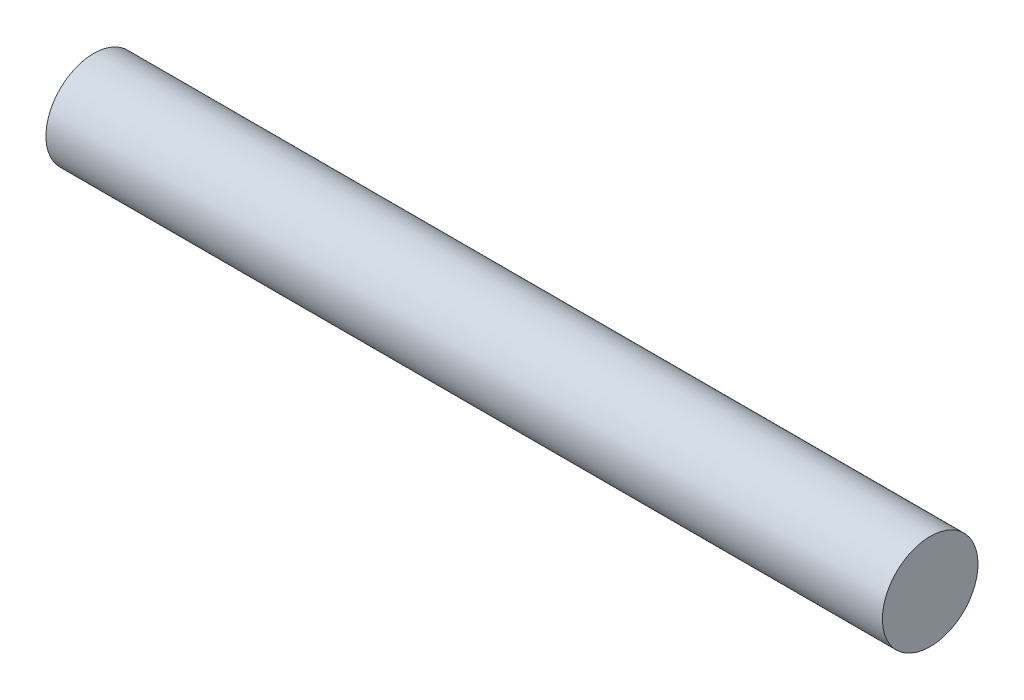
ISO-10303-21;
HEADER;
FILE_DESCRIPTION(('STEP AP214'),'2;1');
FILE_NAME('part.step','',(''),(''),'','','');
FILE_SCHEMA(('AUTOMOTIVE_DESIGN { 1 0 10303 214 1 1 1 1 }'));
ENDSEC;
DATA;
#1=APPLICATION_CONTEXT('core data for automotive mechanical design processes');
#2=APPLICATION_PROTOCOL_DEFINITION('international standard','automotive_design',2000,#1);
#3=PRODUCT_CONTEXT('',#1,'mechanical');
#4=PRODUCT('Part','Part','',(#3));
#5=PRODUCT_RELATED_PRODUCT_CATEGORY('part','',(#4));
#6=PRODUCT_DEFINITION_FORMATION('','',#4);
#7=PRODUCT_DEFINITION_CONTEXT('part definition',#1,'design');
#8=PRODUCT_DEFINITION('design','',#6,#7);
#9=PRODUCT_DEFINITION_SHAPE('','',#8);
#10=(LENGTH_UNIT() NAMED_UNIT(*) SI_UNIT(.MILLI.,.METRE.));
#11=(NAMED_UNIT(*) PLANE_ANGLE_UNIT() SI_UNIT($,.RADIAN.));
#12=(NAMED_UNIT(*) SI_UNIT($,.STERADIAN.) SOLID_ANGLE_UNIT());
#13=UNCERTAINTY_MEASURE_WITH_UNIT(LENGTH_MEASURE(1.E-05),#10,'distance_accuracy_value','');
#14=(GEOMETRIC_REPRESENTATION_CONTEXT(3) GLOBAL_UNCERTAINTY_ASSIGNED_CONTEXT((#13)) GLOBAL_UNIT_ASSIGNED_CONTEXT((#10,
#11,#12)) REPRESENTATION_CONTEXT('',''));
#15=CARTESIAN_POINT('',(0.,0.,0.));
#16=DIRECTION('',(0.,0.,1.));
#17=DIRECTION('',(1.,0.,0.));
#18=AXIS2_PLACEMENT_3D('',#15,#16,#17);
#19=CARTESIAN_POINT('',(70.,0.,0.));
#20=DIRECTION('',(-1.,0.,0.));
#21=DIRECTION('',(0.,0.,1.));
#22=AXIS2_PLACEMENT_3D('',#19,#20,#21);
#23=CYLINDRICAL_SURFACE('',#22,4.);
#24=CARTESIAN_POINT('',(70.,0.,0.));
#25=DIRECTION('',(1.,0.,0.));
#26=DIRECTION('',(0.,0.,-1.));
#27=AXIS2_PLACEMENT_3D('',#24,#25,#26);
#28=CIRCLE('',#27,4.);
#29=CARTESIAN_POINT('',(70.,0.,-4.));
#30=VERTEX_POINT('',#29);
#31=EDGE_CURVE('E10',#30,#30,#28,.T.);
#32=ORIENTED_EDGE('',*,*,#31,.F.);
#33=EDGE_LOOP('',(#32));
#34=FACE_BOUND('',#33,.T.);
#35=CARTESIAN_POINT('',(0.,0.,0.));
#36=DIRECTION('',(1.,0.,0.));
#37=DIRECTION('',(0.,0.,-1.));
#38=AXIS2_PLACEMENT_3D('',#35,#36,#37);
#39=CIRCLE('',#38,4.);
#40=CARTESIAN_POINT('',(0.,0.,-4.));
#41=VERTEX_POINT('',#40);
#42=EDGE_CURVE('E36',#41,#41,#39,.T.);
#43=ORIENTED_EDGE('',*,*,#42,.T.);
#44=EDGE_LOOP('',(#43));
#45=FACE_BOUND('',#44,.T.);
#46=ADVANCED_FACE('F33',(#34,#45),#23,.T.);
#47=CARTESIAN_POINT('',(70.,0.,0.));
#48=DIRECTION('',(1.,0.,0.));
#49=DIRECTION('',(0.,0.,-1.));
#50=AXIS2_PLACEMENT_3D('',#47,#48,#49);
#51=PLANE('',#50);
#52=ORIENTED_EDGE('',*,*,#31,.T.);
#53=EDGE_LOOP('',(#52));
#54=FACE_BOUND('',#53,.T.);
#55=ADVANCED_FACE('F48',(#54),#51,.T.);
#56=CARTESIAN_POINT('',(0.,0.,0.));
#57=DIRECTION('',(1.,0.,0.));
#58=DIRECTION('',(0.,0.,-1.));
#59=AXIS2_PLACEMENT_3D('',#56,#57,#58);
#60=PLANE('',#59);
#61=ORIENTED_EDGE('',*,*,#42,.F.);
#62=EDGE_LOOP('',(#61));
#63=FACE_BOUND('',#62,.T.);
#64=ADVANCED_FACE('F46',(#63),#60,.F.);
#65=CLOSED_SHELL('',(#46,#55,#64));
#66=MANIFOLD_SOLID_BREP('B2',#65);
#67=ADVANCED_BREP_SHAPE_REPRESENTATION('',(#18,#66),#14);
#68=SHAPE_DEFINITION_REPRESENTATION(#9,#67);
ENDSEC;
END-ISO-10303-21;
